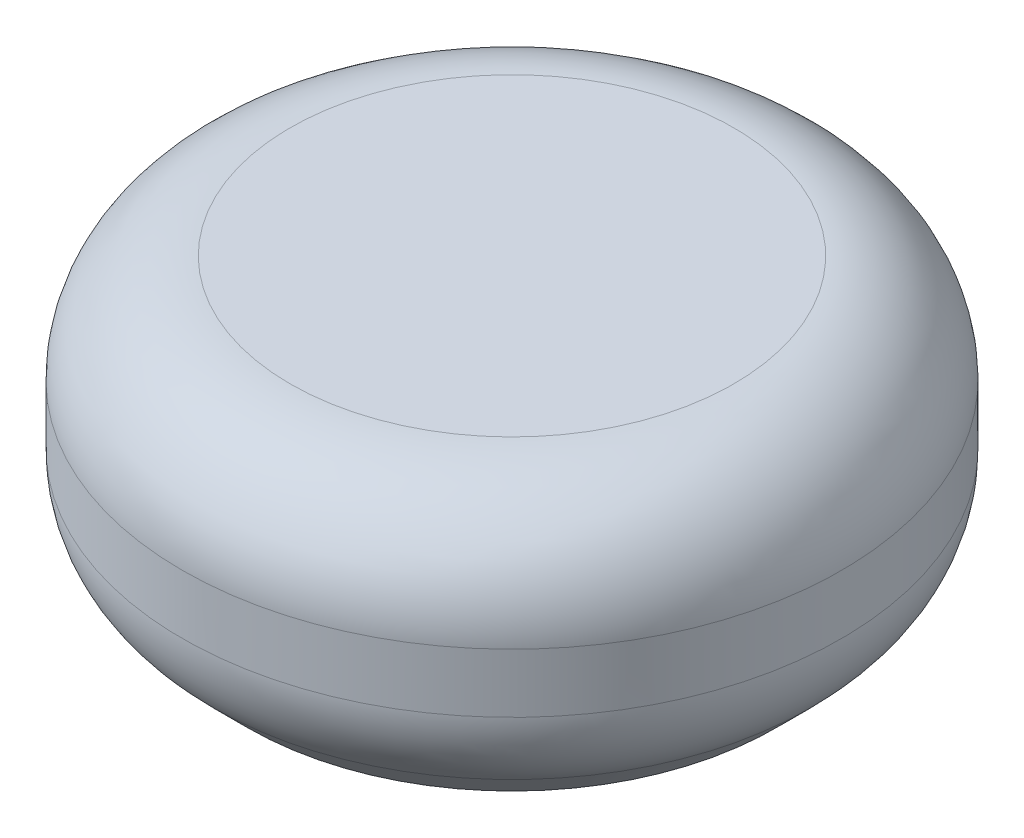
ISO-10303-21;
HEADER;
FILE_DESCRIPTION(('STEP AP214'),'2;1');
FILE_NAME('part.step','',(''),(''),'','','');
FILE_SCHEMA(('AUTOMOTIVE_DESIGN { 1 0 10303 214 1 1 1 1 }'));
ENDSEC;
DATA;
#1=APPLICATION_CONTEXT('core data for automotive mechanical design processes');
#2=APPLICATION_PROTOCOL_DEFINITION('international standard','automotive_design',2000,#1);
#3=PRODUCT_CONTEXT('',#1,'mechanical');
#4=PRODUCT('Part','Part','',(#3));
#5=PRODUCT_RELATED_PRODUCT_CATEGORY('part','',(#4));
#6=PRODUCT_DEFINITION_FORMATION('','',#4);
#7=PRODUCT_DEFINITION_CONTEXT('part definition',#1,'design');
#8=PRODUCT_DEFINITION('design','',#6,#7);
#9=PRODUCT_DEFINITION_SHAPE('','',#8);
#10=(LENGTH_UNIT() NAMED_UNIT(*) SI_UNIT(.MILLI.,.METRE.));
#11=(NAMED_UNIT(*) PLANE_ANGLE_UNIT() SI_UNIT($,.RADIAN.));
#12=(NAMED_UNIT(*) SI_UNIT($,.STERADIAN.) SOLID_ANGLE_UNIT());
#13=UNCERTAINTY_MEASURE_WITH_UNIT(LENGTH_MEASURE(1.E-05),#10,'distance_accuracy_value','');
#14=(GEOMETRIC_REPRESENTATION_CONTEXT(3) GLOBAL_UNCERTAINTY_ASSIGNED_CONTEXT((#13)) GLOBAL_UNIT_ASSIGNED_CONTEXT((#10,
#11,#12)) REPRESENTATION_CONTEXT('',''));
#15=CARTESIAN_POINT('',(0.,0.,0.));
#16=DIRECTION('',(0.,0.,1.));
#17=DIRECTION('',(1.,0.,0.));
#18=AXIS2_PLACEMENT_3D('',#15,#16,#17);
#19=CARTESIAN_POINT('',(0.,15.,0.));
#20=DIRECTION('',(0.,-1.,0.));
#21=DIRECTION('',(0.,0.,-1.));
#22=AXIS2_PLACEMENT_3D('',#19,#20,#21);
#23=CYLINDRICAL_SURFACE('',#22,19.431);
#24=CARTESIAN_POINT('',(0.,8.98025612106925,0.));
#25=DIRECTION('',(0.,-1.,0.));
#26=DIRECTION('',(0.,0.,-1.));
#27=AXIS2_PLACEMENT_3D('',#24,#25,#26);
#28=CIRCLE('',#27,19.431);
#29=CARTESIAN_POINT('',(0.,8.98025612106925,-19.431));
#30=VERTEX_POINT('',#29);
#31=EDGE_CURVE('E47',#30,#30,#28,.F.);
#32=ORIENTED_EDGE('',*,*,#31,.T.);
#33=EDGE_LOOP('',(#32));
#34=FACE_BOUND('',#33,.T.);
#35=CARTESIAN_POINT('',(0.,12.46,0.));
#36=DIRECTION('',(0.,1.,0.));
#37=DIRECTION('',(0.,0.,1.));
#38=AXIS2_PLACEMENT_3D('',#35,#36,#37);
#39=CIRCLE('',#38,19.431);
#40=CARTESIAN_POINT('',(0.,12.46,19.431));
#41=VERTEX_POINT('',#40);
#42=EDGE_CURVE('E57',#41,#41,#39,.F.);
#43=ORIENTED_EDGE('',*,*,#42,.T.);
#44=EDGE_LOOP('',(#43));
#45=FACE_BOUND('',#44,.T.);
#46=ADVANCED_FACE('F39',(#34,#45),#23,.T.);
#47=CARTESIAN_POINT('',(0.,15.,0.));
#48=DIRECTION('',(0.,-1.,0.));
#49=DIRECTION('',(0.,0.,-1.));
#50=AXIS2_PLACEMENT_3D('',#47,#48,#49);
#51=CYLINDRICAL_SURFACE('',#50,15.5625);
#52=CARTESIAN_POINT('',(0.,2.48150000000007,0.));
#53=DIRECTION('',(0.,1.,0.));
#54=DIRECTION('',(0.,0.,1.));
#55=AXIS2_PLACEMENT_3D('',#52,#53,#54);
#56=CIRCLE('',#55,15.5625);
#57=CARTESIAN_POINT('',(0.,2.48150000000007,15.5625));
#58=VERTEX_POINT('',#57);
#59=EDGE_CURVE('E52',#58,#58,#56,.F.);
#60=ORIENTED_EDGE('',*,*,#59,.T.);
#61=EDGE_LOOP('',(#60));
#62=FACE_BOUND('',#61,.T.);
#63=CARTESIAN_POINT('',(0.,15.,0.));
#64=DIRECTION('',(0.,1.,0.));
#65=DIRECTION('',(0.,0.,1.));
#66=AXIS2_PLACEMENT_3D('',#63,#64,#65);
#67=CIRCLE('',#66,15.5625);
#68=CARTESIAN_POINT('',(0.,15.,15.5625));
#69=VERTEX_POINT('',#68);
#70=EDGE_CURVE('E67',#69,#69,#67,.T.);
#71=ORIENTED_EDGE('',*,*,#70,.T.);
#72=EDGE_LOOP('',(#71));
#73=FACE_BOUND('',#72,.T.);
#74=ADVANCED_FACE('F72',(#62,#73),#51,.F.);
#75=CARTESIAN_POINT('',(0.,15.,0.));
#76=DIRECTION('',(0.,1.,0.));
#77=DIRECTION('',(0.,0.,1.));
#78=AXIS2_PLACEMENT_3D('',#75,#76,#77);
#79=PLANE('',#78);
#80=ORIENTED_EDGE('',*,*,#70,.F.);
#81=EDGE_LOOP('',(#80));
#82=FACE_BOUND('',#81,.T.);
#83=ADVANCED_FACE('F74',(#82),#79,.F.);
#84=CARTESIAN_POINT('',(0.,18.81,0.));
#85=DIRECTION('',(0.,1.,0.));
#86=DIRECTION('',(0.,0.,1.));
#87=AXIS2_PLACEMENT_3D('',#84,#85,#86);
#88=PLANE('',#87);
#89=CARTESIAN_POINT('',(0.,18.81,0.));
#90=DIRECTION('',(0.,1.,0.));
#91=DIRECTION('',(0.,0.,1.));
#92=AXIS2_PLACEMENT_3D('',#89,#90,#91);
#93=CIRCLE('',#92,13.081);
#94=CARTESIAN_POINT('',(0.,18.81,13.081));
#95=VERTEX_POINT('',#94);
#96=EDGE_CURVE('E63',#95,#95,#93,.T.);
#97=ORIENTED_EDGE('',*,*,#96,.T.);
#98=EDGE_LOOP('',(#97));
#99=FACE_BOUND('',#98,.T.);
#100=ADVANCED_FACE('F76',(#99),#88,.T.);
#101=CARTESIAN_POINT('',(0.,12.46,0.));
#102=DIRECTION('',(0.,1.,0.));
#103=DIRECTION('',(0.,0.,1.));
#104=AXIS2_PLACEMENT_3D('',#101,#102,#103);
#105=TOROIDAL_SURFACE('',#104,13.081,6.35);
#106=ORIENTED_EDGE('',*,*,#42,.F.);
#107=EDGE_LOOP('',(#106));
#108=FACE_BOUND('',#107,.T.);
#109=ORIENTED_EDGE('',*,*,#96,.F.);
#110=EDGE_LOOP('',(#109));
#111=FACE_BOUND('',#110,.T.);
#112=ADVANCED_FACE('F82',(#108,#111),#105,.T.);
#113=CARTESIAN_POINT('',(0.,6.35000000000011,0.));
#114=DIRECTION('',(0.,1.,0.));
#115=DIRECTION('',(0.,0.,1.));
#116=AXIS2_PLACEMENT_3D('',#113,#114,#115);
#117=CONICAL_SURFACE('',#116,19.431,0.785398163397443);
#118=CARTESIAN_POINT('',(0.,4.49012806053469,0.));
#119=DIRECTION('',(0.,1.,0.));
#120=DIRECTION('',(0.,0.,1.));
#121=AXIS2_PLACEMENT_3D('',#118,#119,#120);
#122=CIRCLE('',#121,17.5711280605346);
#123=CARTESIAN_POINT('',(0.,4.49012806053469,17.5711280605346));
#124=VERTEX_POINT('',#123);
#125=EDGE_CURVE('E10',#124,#124,#122,.F.);
#126=ORIENTED_EDGE('',*,*,#125,.T.);
#127=EDGE_LOOP('',(#126));
#128=FACE_BOUND('',#127,.T.);
#129=ORIENTED_EDGE('',*,*,#59,.F.);
#130=EDGE_LOOP('',(#129));
#131=FACE_BOUND('',#130,.T.);
#132=ADVANCED_FACE('F94',(#128,#131),#117,.T.);
#133=CARTESIAN_POINT('',(0.,8.98025612106925,0.));
#134=DIRECTION('',(0.,-1.,0.));
#135=DIRECTION('',(0.,0.,-1.));
#136=AXIS2_PLACEMENT_3D('',#133,#134,#135);
#137=TOROIDAL_SURFACE('',#136,13.081,6.35);
#138=ORIENTED_EDGE('',*,*,#125,.F.);
#139=EDGE_LOOP('',(#138));
#140=FACE_BOUND('',#139,.T.);
#141=ORIENTED_EDGE('',*,*,#31,.F.);
#142=EDGE_LOOP('',(#141));
#143=FACE_BOUND('',#142,.T.);
#144=ADVANCED_FACE('F41',(#140,#143),#137,.T.);
#145=CLOSED_SHELL('',(#46,#74,#83,#100,#112,#132,#144));
#146=MANIFOLD_SOLID_BREP('B2',#145);
#147=ADVANCED_BREP_SHAPE_REPRESENTATION('',(#18,#146),#14);
#148=SHAPE_DEFINITION_REPRESENTATION(#9,#147);
ENDSEC;
END-ISO-10303-21;
